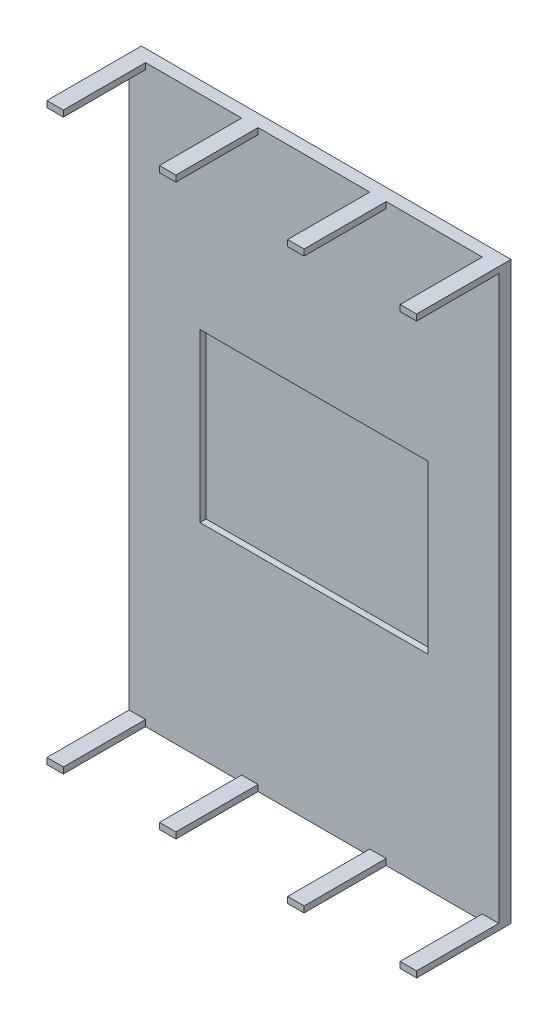
ISO-10303-21;
HEADER;
FILE_DESCRIPTION(('STEP AP214'),'2;1');
FILE_NAME('part.step','',(''),(''),'','','');
FILE_SCHEMA(('AUTOMOTIVE_DESIGN { 1 0 10303 214 1 1 1 1 }'));
ENDSEC;
DATA;
#1=APPLICATION_CONTEXT('core data for automotive mechanical design processes');
#2=APPLICATION_PROTOCOL_DEFINITION('international standard','automotive_design',2000,#1);
#3=PRODUCT_CONTEXT('',#1,'mechanical');
#4=PRODUCT('Part','Part','',(#3));
#5=PRODUCT_RELATED_PRODUCT_CATEGORY('part','',(#4));
#6=PRODUCT_DEFINITION_FORMATION('','',#4);
#7=PRODUCT_DEFINITION_CONTEXT('part definition',#1,'design');
#8=PRODUCT_DEFINITION('design','',#6,#7);
#9=PRODUCT_DEFINITION_SHAPE('','',#8);
#10=(LENGTH_UNIT() NAMED_UNIT(*) SI_UNIT(.MILLI.,.METRE.));
#11=(NAMED_UNIT(*) PLANE_ANGLE_UNIT() SI_UNIT($,.RADIAN.));
#12=(NAMED_UNIT(*) SI_UNIT($,.STERADIAN.) SOLID_ANGLE_UNIT());
#13=UNCERTAINTY_MEASURE_WITH_UNIT(LENGTH_MEASURE(1.E-05),#10,'distance_accuracy_value','');
#14=(GEOMETRIC_REPRESENTATION_CONTEXT(3) GLOBAL_UNCERTAINTY_ASSIGNED_CONTEXT((#13)) GLOBAL_UNIT_ASSIGNED_CONTEXT((#10,
#11,#12)) REPRESENTATION_CONTEXT('',''));
#15=CARTESIAN_POINT('',(0.,0.,0.));
#16=DIRECTION('',(0.,0.,1.));
#17=DIRECTION('',(1.,0.,0.));
#18=AXIS2_PLACEMENT_3D('',#15,#16,#17);
#19=CARTESIAN_POINT('',(0.,0.,3.));
#20=DIRECTION('',(0.,0.,1.));
#21=DIRECTION('',(1.,0.,0.));
#22=AXIS2_PLACEMENT_3D('',#19,#20,#21);
#23=PLANE('',#22);
#24=DIRECTION('',(0.,-1.,0.));
#25=VECTOR('',#24,1.);
#26=CARTESIAN_POINT('',(-27.75,-20.35,3.));
#27=LINE('',#26,#25);
#28=CARTESIAN_POINT('',(-27.75,20.35,3.));
#29=VERTEX_POINT('',#28);
#30=CARTESIAN_POINT('',(-27.75,-20.35,3.));
#31=VERTEX_POINT('',#30);
#32=EDGE_CURVE('E63',#29,#31,#27,.T.);
#33=ORIENTED_EDGE('',*,*,#32,.F.);
#34=DIRECTION('',(-1.,0.,0.));
#35=VECTOR('',#34,1.);
#36=CARTESIAN_POINT('',(-27.75,20.35,3.));
#37=LINE('',#36,#35);
#38=CARTESIAN_POINT('',(27.75,20.35,3.));
#39=VERTEX_POINT('',#38);
#40=EDGE_CURVE('E304',#39,#29,#37,.T.);
#41=ORIENTED_EDGE('',*,*,#40,.F.);
#42=DIRECTION('',(0.,1.,0.));
#43=VECTOR('',#42,1.);
#44=CARTESIAN_POINT('',(27.75,-20.35,3.));
#45=LINE('',#44,#43);
#46=CARTESIAN_POINT('',(27.75,-20.35,3.));
#47=VERTEX_POINT('',#46);
#48=EDGE_CURVE('E308',#47,#39,#45,.T.);
#49=ORIENTED_EDGE('',*,*,#48,.F.);
#50=DIRECTION('',(1.,0.,0.));
#51=VECTOR('',#50,1.);
#52=CARTESIAN_POINT('',(-27.75,-20.35,3.));
#53=LINE('',#52,#51);
#54=EDGE_CURVE('E317',#31,#47,#53,.T.);
#55=ORIENTED_EDGE('',*,*,#54,.F.);
#56=EDGE_LOOP('',(#33,#41,#49,#55));
#57=FACE_BOUND('',#56,.T.);
#58=DIRECTION('',(0.,-1.,0.));
#59=VECTOR('',#58,1.);
#60=CARTESIAN_POINT('',(-45.,70.,3.));
#61=LINE('',#60,#59);
#62=CARTESIAN_POINT('',(-45.,68.5,3.));
#63=VERTEX_POINT('',#62);
#64=CARTESIAN_POINT('',(-45.,-68.5,3.));
#65=VERTEX_POINT('',#64);
#66=EDGE_CURVE('E635',#63,#65,#61,.T.);
#67=ORIENTED_EDGE('',*,*,#66,.T.);
#68=DIRECTION('',(1.,0.,0.));
#69=VECTOR('',#68,1.);
#70=CARTESIAN_POINT('',(0.,-68.5,3.));
#71=LINE('',#70,#69);
#72=CARTESIAN_POINT('',(-41.,-68.5,3.));
#73=VERTEX_POINT('',#72);
#74=EDGE_CURVE('E497',#65,#73,#71,.T.);
#75=ORIENTED_EDGE('',*,*,#74,.T.);
#76=DIRECTION('',(0.,1.,0.));
#77=VECTOR('',#76,1.);
#78=CARTESIAN_POINT('',(-41.,0.,3.));
#79=LINE('',#78,#77);
#80=CARTESIAN_POINT('',(-41.,-70.,3.));
#81=VERTEX_POINT('',#80);
#82=EDGE_CURVE('E454',#81,#73,#79,.T.);
#83=ORIENTED_EDGE('',*,*,#82,.F.);
#84=DIRECTION('',(1.,0.,0.));
#85=VECTOR('',#84,1.);
#86=CARTESIAN_POINT('',(45.,-70.,3.));
#87=LINE('',#86,#85);
#88=CARTESIAN_POINT('',(-17.6,-70.,3.));
#89=VERTEX_POINT('',#88);
#90=EDGE_CURVE('E642',#81,#89,#87,.T.);
#91=ORIENTED_EDGE('',*,*,#90,.T.);
#92=DIRECTION('',(0.,1.,0.));
#93=VECTOR('',#92,1.);
#94=CARTESIAN_POINT('',(-17.6000000000003,0.,3.));
#95=LINE('',#94,#93);
#96=CARTESIAN_POINT('',(-17.6,-68.5,3.));
#97=VERTEX_POINT('',#96);
#98=EDGE_CURVE('E350',#89,#97,#95,.T.);
#99=ORIENTED_EDGE('',*,*,#98,.T.);
#100=DIRECTION('',(1.,0.,0.));
#101=VECTOR('',#100,1.);
#102=CARTESIAN_POINT('',(0.,-68.5,3.));
#103=LINE('',#102,#101);
#104=CARTESIAN_POINT('',(-13.6,-68.5,3.));
#105=VERTEX_POINT('',#104);
#106=EDGE_CURVE('E353',#97,#105,#103,.T.);
#107=ORIENTED_EDGE('',*,*,#106,.T.);
#108=DIRECTION('',(0.,1.,0.));
#109=VECTOR('',#108,1.);
#110=CARTESIAN_POINT('',(-13.6,0.,3.));
#111=LINE('',#110,#109);
#112=CARTESIAN_POINT('',(-13.6,-70.,3.));
#113=VERTEX_POINT('',#112);
#114=EDGE_CURVE('E357',#113,#105,#111,.T.);
#115=ORIENTED_EDGE('',*,*,#114,.F.);
#116=CARTESIAN_POINT('',(13.6,-70.,3.));
#117=VERTEX_POINT('',#116);
#118=EDGE_CURVE('E641',#113,#117,#87,.T.);
#119=ORIENTED_EDGE('',*,*,#118,.T.);
#120=DIRECTION('',(0.,1.,0.));
#121=VECTOR('',#120,1.);
#122=CARTESIAN_POINT('',(13.6,-70.,3.));
#123=LINE('',#122,#121);
#124=CARTESIAN_POINT('',(13.6,-68.5,3.));
#125=VERTEX_POINT('',#124);
#126=EDGE_CURVE('E393',#117,#125,#123,.T.);
#127=ORIENTED_EDGE('',*,*,#126,.T.);
#128=DIRECTION('',(-1.,0.,0.));
#129=VECTOR('',#128,1.);
#130=CARTESIAN_POINT('',(17.6,-68.5,3.));
#131=LINE('',#130,#129);
#132=CARTESIAN_POINT('',(17.6,-68.5,3.));
#133=VERTEX_POINT('',#132);
#134=EDGE_CURVE('E396',#133,#125,#131,.T.);
#135=ORIENTED_EDGE('',*,*,#134,.F.);
#136=DIRECTION('',(0.,1.,0.));
#137=VECTOR('',#136,1.);
#138=CARTESIAN_POINT('',(17.6,-70.,3.));
#139=LINE('',#138,#137);
#140=CARTESIAN_POINT('',(17.6,-70.,3.));
#141=VERTEX_POINT('',#140);
#142=EDGE_CURVE('E337',#141,#133,#139,.T.);
#143=ORIENTED_EDGE('',*,*,#142,.F.);
#144=CARTESIAN_POINT('',(41.,-70.,3.));
#145=VERTEX_POINT('',#144);
#146=EDGE_CURVE('E638',#141,#145,#87,.T.);
#147=ORIENTED_EDGE('',*,*,#146,.T.);
#148=DIRECTION('',(0.,1.,0.));
#149=VECTOR('',#148,1.);
#150=CARTESIAN_POINT('',(41.,-70.,3.));
#151=LINE('',#150,#149);
#152=CARTESIAN_POINT('',(41.,-68.5,3.));
#153=VERTEX_POINT('',#152);
#154=EDGE_CURVE('E429',#145,#153,#151,.T.);
#155=ORIENTED_EDGE('',*,*,#154,.T.);
#156=DIRECTION('',(-1.,0.,0.));
#157=VECTOR('',#156,1.);
#158=CARTESIAN_POINT('',(45.,-68.5,3.));
#159=LINE('',#158,#157);
#160=CARTESIAN_POINT('',(45.,-68.5,3.));
#161=VERTEX_POINT('',#160);
#162=EDGE_CURVE('E380',#161,#153,#159,.T.);
#163=ORIENTED_EDGE('',*,*,#162,.F.);
#164=DIRECTION('',(0.,1.,0.));
#165=VECTOR('',#164,1.);
#166=CARTESIAN_POINT('',(45.,70.,3.));
#167=LINE('',#166,#165);
#168=CARTESIAN_POINT('',(45.,68.5,3.));
#169=VERTEX_POINT('',#168);
#170=EDGE_CURVE('E643',#161,#169,#167,.T.);
#171=ORIENTED_EDGE('',*,*,#170,.T.);
#172=DIRECTION('',(-1.,0.,0.));
#173=VECTOR('',#172,1.);
#174=CARTESIAN_POINT('',(0.,68.5,3.));
#175=LINE('',#174,#173);
#176=CARTESIAN_POINT('',(41.,68.5,3.));
#177=VERTEX_POINT('',#176);
#178=EDGE_CURVE('E463',#169,#177,#175,.T.);
#179=ORIENTED_EDGE('',*,*,#178,.T.);
#180=DIRECTION('',(0.,-1.,0.));
#181=VECTOR('',#180,1.);
#182=CARTESIAN_POINT('',(41.,0.,3.));
#183=LINE('',#182,#181);
#184=CARTESIAN_POINT('',(41.,70.,3.));
#185=VERTEX_POINT('',#184);
#186=EDGE_CURVE('E466',#185,#177,#183,.T.);
#187=ORIENTED_EDGE('',*,*,#186,.F.);
#188=DIRECTION('',(-1.,0.,0.));
#189=VECTOR('',#188,1.);
#190=CARTESIAN_POINT('',(45.,70.,3.));
#191=LINE('',#190,#189);
#192=CARTESIAN_POINT('',(17.6,70.,3.));
#193=VERTEX_POINT('',#192);
#194=EDGE_CURVE('E634',#185,#193,#191,.T.);
#195=ORIENTED_EDGE('',*,*,#194,.T.);
#196=DIRECTION('',(0.,-1.,0.));
#197=VECTOR('',#196,1.);
#198=CARTESIAN_POINT('',(17.6000000000003,0.,3.));
#199=LINE('',#198,#197);
#200=CARTESIAN_POINT('',(17.6,68.5,3.));
#201=VERTEX_POINT('',#200);
#202=EDGE_CURVE('E71',#193,#201,#199,.T.);
#203=ORIENTED_EDGE('',*,*,#202,.T.);
#204=DIRECTION('',(-1.,0.,0.));
#205=VECTOR('',#204,1.);
#206=CARTESIAN_POINT('',(0.,68.5,3.));
#207=LINE('',#206,#205);
#208=CARTESIAN_POINT('',(13.6,68.5,3.));
#209=VERTEX_POINT('',#208);
#210=EDGE_CURVE('E576',#201,#209,#207,.T.);
#211=ORIENTED_EDGE('',*,*,#210,.T.);
#212=DIRECTION('',(0.,-1.,0.));
#213=VECTOR('',#212,1.);
#214=CARTESIAN_POINT('',(13.6,0.,3.));
#215=LINE('',#214,#213);
#216=CARTESIAN_POINT('',(13.6,70.,3.));
#217=VERTEX_POINT('',#216);
#218=EDGE_CURVE('E522',#217,#209,#215,.T.);
#219=ORIENTED_EDGE('',*,*,#218,.F.);
#220=CARTESIAN_POINT('',(-13.6,70.,3.));
#221=VERTEX_POINT('',#220);
#222=EDGE_CURVE('E632',#217,#221,#191,.T.);
#223=ORIENTED_EDGE('',*,*,#222,.T.);
#224=DIRECTION('',(0.,-1.,0.));
#225=VECTOR('',#224,1.);
#226=CARTESIAN_POINT('',(-13.6,0.,3.));
#227=LINE('',#226,#225);
#228=CARTESIAN_POINT('',(-13.6,68.5,3.));
#229=VERTEX_POINT('',#228);
#230=EDGE_CURVE('E544',#221,#229,#227,.T.);
#231=ORIENTED_EDGE('',*,*,#230,.T.);
#232=DIRECTION('',(1.,0.,0.));
#233=VECTOR('',#232,1.);
#234=CARTESIAN_POINT('',(0.,68.5,3.));
#235=LINE('',#234,#233);
#236=CARTESIAN_POINT('',(-17.6,68.5,3.));
#237=VERTEX_POINT('',#236);
#238=EDGE_CURVE('E535',#237,#229,#235,.T.);
#239=ORIENTED_EDGE('',*,*,#238,.F.);
#240=DIRECTION('',(0.,-1.,0.));
#241=VECTOR('',#240,1.);
#242=CARTESIAN_POINT('',(-17.6000000000003,0.,3.));
#243=LINE('',#242,#241);
#244=CARTESIAN_POINT('',(-17.6,70.,3.));
#245=VERTEX_POINT('',#244);
#246=EDGE_CURVE('E539',#245,#237,#243,.T.);
#247=ORIENTED_EDGE('',*,*,#246,.F.);
#248=CARTESIAN_POINT('',(-41.,70.,3.));
#249=VERTEX_POINT('',#248);
#250=EDGE_CURVE('E629',#245,#249,#191,.T.);
#251=ORIENTED_EDGE('',*,*,#250,.T.);
#252=DIRECTION('',(0.,-1.,0.));
#253=VECTOR('',#252,1.);
#254=CARTESIAN_POINT('',(-41.,0.,3.));
#255=LINE('',#254,#253);
#256=CARTESIAN_POINT('',(-41.,68.5,3.));
#257=VERTEX_POINT('',#256);
#258=EDGE_CURVE('E547',#249,#257,#255,.T.);
#259=ORIENTED_EDGE('',*,*,#258,.T.);
#260=DIRECTION('',(1.,0.,0.));
#261=VECTOR('',#260,1.);
#262=CARTESIAN_POINT('',(0.,68.5,3.));
#263=LINE('',#262,#261);
#264=EDGE_CURVE('E601',#63,#257,#263,.T.);
#265=ORIENTED_EDGE('',*,*,#264,.F.);
#266=EDGE_LOOP('',(#67,#75,#83,#91,#99,#107,#115,#119,#127,#135,#143,#147,#155,#163,#171,#179,
#187,#195,#203,#211,#219,#223,#231,#239,#247,#251,#259,#265));
#267=FACE_BOUND('',#266,.T.);
#268=ADVANCED_FACE('F47',(#57,#267),#23,.T.);
#269=CARTESIAN_POINT('',(45.,70.,3.));
#270=DIRECTION('',(0.,-1.,0.));
#271=DIRECTION('',(0.,0.,-1.));
#272=AXIS2_PLACEMENT_3D('',#269,#270,#271);
#273=PLANE('',#272);
#274=DIRECTION('',(-1.,0.,0.));
#275=VECTOR('',#274,1.);
#276=CARTESIAN_POINT('',(45.,70.,0.));
#277=LINE('',#276,#275);
#278=CARTESIAN_POINT('',(45.,70.,0.));
#279=VERTEX_POINT('',#278);
#280=CARTESIAN_POINT('',(-45.,70.,0.));
#281=VERTEX_POINT('',#280);
#282=EDGE_CURVE('E628',#279,#281,#277,.T.);
#283=ORIENTED_EDGE('',*,*,#282,.T.);
#284=DIRECTION('',(0.,0.,-1.));
#285=VECTOR('',#284,1.);
#286=CARTESIAN_POINT('',(-45.,70.,3.));
#287=LINE('',#286,#285);
#288=CARTESIAN_POINT('',(-45.,70.,23.));
#289=VERTEX_POINT('',#288);
#290=EDGE_CURVE('E11',#289,#281,#287,.T.);
#291=ORIENTED_EDGE('',*,*,#290,.F.);
#292=DIRECTION('',(-1.,0.,0.));
#293=VECTOR('',#292,1.);
#294=CARTESIAN_POINT('',(0.,70.,23.));
#295=LINE('',#294,#293);
#296=CARTESIAN_POINT('',(-41.,70.,23.));
#297=VERTEX_POINT('',#296);
#298=EDGE_CURVE('E600',#297,#289,#295,.T.);
#299=ORIENTED_EDGE('',*,*,#298,.F.);
#300=DIRECTION('',(0.,0.,-1.));
#301=VECTOR('',#300,1.);
#302=CARTESIAN_POINT('',(-41.,70.,23.));
#303=LINE('',#302,#301);
#304=EDGE_CURVE('E624',#297,#249,#303,.T.);
#305=ORIENTED_EDGE('',*,*,#304,.T.);
#306=ORIENTED_EDGE('',*,*,#250,.F.);
#307=DIRECTION('',(0.,0.,-1.));
#308=VECTOR('',#307,1.);
#309=CARTESIAN_POINT('',(-17.6,70.,23.));
#310=LINE('',#309,#308);
#311=CARTESIAN_POINT('',(-17.6,70.,23.));
#312=VERTEX_POINT('',#311);
#313=EDGE_CURVE('E521',#312,#245,#310,.T.);
#314=ORIENTED_EDGE('',*,*,#313,.F.);
#315=DIRECTION('',(-1.,0.,0.));
#316=VECTOR('',#315,1.);
#317=CARTESIAN_POINT('',(0.,70.,23.));
#318=LINE('',#317,#316);
#319=CARTESIAN_POINT('',(-13.6,70.,23.));
#320=VERTEX_POINT('',#319);
#321=EDGE_CURVE('E553',#320,#312,#318,.T.);
#322=ORIENTED_EDGE('',*,*,#321,.F.);
#323=DIRECTION('',(0.,0.,-1.));
#324=VECTOR('',#323,1.);
#325=CARTESIAN_POINT('',(-13.6,70.,23.));
#326=LINE('',#325,#324);
#327=EDGE_CURVE('E517',#320,#221,#326,.T.);
#328=ORIENTED_EDGE('',*,*,#327,.T.);
#329=ORIENTED_EDGE('',*,*,#222,.F.);
#330=DIRECTION('',(0.,0.,-1.));
#331=VECTOR('',#330,1.);
#332=CARTESIAN_POINT('',(13.6,70.,23.));
#333=LINE('',#332,#331);
#334=CARTESIAN_POINT('',(13.6,70.,23.));
#335=VERTEX_POINT('',#334);
#336=EDGE_CURVE('E471',#335,#217,#333,.T.);
#337=ORIENTED_EDGE('',*,*,#336,.F.);
#338=DIRECTION('',(-1.,0.,0.));
#339=VECTOR('',#338,1.);
#340=CARTESIAN_POINT('',(0.,70.,23.));
#341=LINE('',#340,#339);
#342=CARTESIAN_POINT('',(17.6,70.,23.));
#343=VERTEX_POINT('',#342);
#344=EDGE_CURVE('E577',#343,#335,#341,.T.);
#345=ORIENTED_EDGE('',*,*,#344,.F.);
#346=DIRECTION('',(0.,0.,-1.));
#347=VECTOR('',#346,1.);
#348=CARTESIAN_POINT('',(17.6,70.,23.));
#349=LINE('',#348,#347);
#350=EDGE_CURVE('E569',#343,#193,#349,.T.);
#351=ORIENTED_EDGE('',*,*,#350,.T.);
#352=ORIENTED_EDGE('',*,*,#194,.F.);
#353=DIRECTION('',(0.,0.,-1.));
#354=VECTOR('',#353,1.);
#355=CARTESIAN_POINT('',(41.,70.,23.));
#356=LINE('',#355,#354);
#357=CARTESIAN_POINT('',(41.,70.,23.));
#358=VERTEX_POINT('',#357);
#359=EDGE_CURVE('E449',#358,#185,#356,.T.);
#360=ORIENTED_EDGE('',*,*,#359,.F.);
#361=DIRECTION('',(-1.,0.,0.));
#362=VECTOR('',#361,1.);
#363=CARTESIAN_POINT('',(0.,70.,23.));
#364=LINE('',#363,#362);
#365=CARTESIAN_POINT('',(45.,70.,23.));
#366=VERTEX_POINT('',#365);
#367=EDGE_CURVE('E467',#366,#358,#364,.T.);
#368=ORIENTED_EDGE('',*,*,#367,.F.);
#369=DIRECTION('',(0.,0.,-1.));
#370=VECTOR('',#369,1.);
#371=CARTESIAN_POINT('',(45.,70.,3.));
#372=LINE('',#371,#370);
#373=EDGE_CURVE('E646',#366,#279,#372,.T.);
#374=ORIENTED_EDGE('',*,*,#373,.T.);
#375=EDGE_LOOP('',(#283,#291,#299,#305,#306,#314,#322,#328,#329,#337,#345,#351,#352,#360,#368,#374));
#376=FACE_BOUND('',#375,.T.);
#377=ADVANCED_FACE('F49',(#376),#273,.F.);
#378=CARTESIAN_POINT('',(-45.,70.,3.));
#379=DIRECTION('',(1.,0.,0.));
#380=DIRECTION('',(0.,1.,0.));
#381=AXIS2_PLACEMENT_3D('',#378,#379,#380);
#382=PLANE('',#381);
#383=DIRECTION('',(0.,-1.,0.));
#384=VECTOR('',#383,1.);
#385=CARTESIAN_POINT('',(-45.,70.,0.));
#386=LINE('',#385,#384);
#387=CARTESIAN_POINT('',(-45.,-70.,0.));
#388=VERTEX_POINT('',#387);
#389=EDGE_CURVE('E650',#281,#388,#386,.T.);
#390=ORIENTED_EDGE('',*,*,#389,.T.);
#391=DIRECTION('',(0.,0.,-1.));
#392=VECTOR('',#391,1.);
#393=CARTESIAN_POINT('',(-45.,-70.,3.));
#394=LINE('',#393,#392);
#395=CARTESIAN_POINT('',(-45.,-70.,23.));
#396=VERTEX_POINT('',#395);
#397=EDGE_CURVE('E56',#396,#388,#394,.T.);
#398=ORIENTED_EDGE('',*,*,#397,.F.);
#399=DIRECTION('',(0.,-1.,0.));
#400=VECTOR('',#399,1.);
#401=CARTESIAN_POINT('',(-45.,0.,23.));
#402=LINE('',#401,#400);
#403=CARTESIAN_POINT('',(-45.,-68.5,23.));
#404=VERTEX_POINT('',#403);
#405=EDGE_CURVE('E496',#404,#396,#402,.T.);
#406=ORIENTED_EDGE('',*,*,#405,.F.);
#407=DIRECTION('',(0.,0.,-1.));
#408=VECTOR('',#407,1.);
#409=CARTESIAN_POINT('',(-45.,-68.5,23.));
#410=LINE('',#409,#408);
#411=EDGE_CURVE('E492',#404,#65,#410,.T.);
#412=ORIENTED_EDGE('',*,*,#411,.T.);
#413=ORIENTED_EDGE('',*,*,#66,.F.);
#414=DIRECTION('',(0.,0.,-1.));
#415=VECTOR('',#414,1.);
#416=CARTESIAN_POINT('',(-45.,68.5,23.));
#417=LINE('',#416,#415);
#418=CARTESIAN_POINT('',(-45.,68.5,23.));
#419=VERTEX_POINT('',#418);
#420=EDGE_CURVE('E620',#419,#63,#417,.T.);
#421=ORIENTED_EDGE('',*,*,#420,.F.);
#422=DIRECTION('',(0.,-1.,0.));
#423=VECTOR('',#422,1.);
#424=CARTESIAN_POINT('',(-45.,0.,23.));
#425=LINE('',#424,#423);
#426=EDGE_CURVE('E605',#289,#419,#425,.T.);
#427=ORIENTED_EDGE('',*,*,#426,.F.);
#428=ORIENTED_EDGE('',*,*,#290,.T.);
#429=EDGE_LOOP('',(#390,#398,#406,#412,#413,#421,#427,#428));
#430=FACE_BOUND('',#429,.T.);
#431=ADVANCED_FACE('F723',(#430),#382,.F.);
#432=CARTESIAN_POINT('',(45.,-70.,3.));
#433=DIRECTION('',(0.,1.,0.));
#434=DIRECTION('',(-1.,0.,0.));
#435=AXIS2_PLACEMENT_3D('',#432,#433,#434);
#436=PLANE('',#435);
#437=DIRECTION('',(1.,0.,0.));
#438=VECTOR('',#437,1.);
#439=CARTESIAN_POINT('',(45.,-70.,0.));
#440=LINE('',#439,#438);
#441=CARTESIAN_POINT('',(45.,-70.,0.));
#442=VERTEX_POINT('',#441);
#443=EDGE_CURVE('E653',#388,#442,#440,.T.);
#444=ORIENTED_EDGE('',*,*,#443,.T.);
#445=DIRECTION('',(0.,0.,-1.));
#446=VECTOR('',#445,1.);
#447=CARTESIAN_POINT('',(45.,-70.,3.));
#448=LINE('',#447,#446);
#449=CARTESIAN_POINT('',(45.,-70.,23.));
#450=VERTEX_POINT('',#449);
#451=EDGE_CURVE('E661',#450,#442,#448,.T.);
#452=ORIENTED_EDGE('',*,*,#451,.F.);
#453=DIRECTION('',(-1.,0.,0.));
#454=VECTOR('',#453,1.);
#455=CARTESIAN_POINT('',(45.,-70.,23.));
#456=LINE('',#455,#454);
#457=CARTESIAN_POINT('',(41.,-70.,23.));
#458=VERTEX_POINT('',#457);
#459=EDGE_CURVE('E428',#450,#458,#456,.T.);
#460=ORIENTED_EDGE('',*,*,#459,.T.);
#461=DIRECTION('',(0.,0.,-1.));
#462=VECTOR('',#461,1.);
#463=CARTESIAN_POINT('',(41.,-70.,23.));
#464=LINE('',#463,#462);
#465=EDGE_CURVE('E424',#458,#145,#464,.T.);
#466=ORIENTED_EDGE('',*,*,#465,.T.);
#467=ORIENTED_EDGE('',*,*,#146,.F.);
#468=DIRECTION('',(0.,0.,-1.));
#469=VECTOR('',#468,1.);
#470=CARTESIAN_POINT('',(17.6,-70.,23.));
#471=LINE('',#470,#469);
#472=CARTESIAN_POINT('',(17.6,-70.,23.));
#473=VERTEX_POINT('',#472);
#474=EDGE_CURVE('E388',#473,#141,#471,.T.);
#475=ORIENTED_EDGE('',*,*,#474,.F.);
#476=DIRECTION('',(-1.,0.,0.));
#477=VECTOR('',#476,1.);
#478=CARTESIAN_POINT('',(17.6,-70.,23.));
#479=LINE('',#478,#477);
#480=CARTESIAN_POINT('',(13.6,-70.,23.));
#481=VERTEX_POINT('',#480);
#482=EDGE_CURVE('E392',#473,#481,#479,.T.);
#483=ORIENTED_EDGE('',*,*,#482,.T.);
#484=DIRECTION('',(0.,0.,-1.));
#485=VECTOR('',#484,1.);
#486=CARTESIAN_POINT('',(13.6,-70.,23.));
#487=LINE('',#486,#485);
#488=EDGE_CURVE('E384',#481,#117,#487,.T.);
#489=ORIENTED_EDGE('',*,*,#488,.T.);
#490=ORIENTED_EDGE('',*,*,#118,.F.);
#491=DIRECTION('',(0.,0.,-1.));
#492=VECTOR('',#491,1.);
#493=CARTESIAN_POINT('',(-13.6,-70.,23.));
#494=LINE('',#493,#492);
#495=CARTESIAN_POINT('',(-13.6,-70.,23.));
#496=VERTEX_POINT('',#495);
#497=EDGE_CURVE('E332',#496,#113,#494,.T.);
#498=ORIENTED_EDGE('',*,*,#497,.F.);
#499=DIRECTION('',(1.,0.,0.));
#500=VECTOR('',#499,1.);
#501=CARTESIAN_POINT('',(0.,-70.,23.));
#502=LINE('',#501,#500);
#503=CARTESIAN_POINT('',(-17.6,-70.,23.));
#504=VERTEX_POINT('',#503);
#505=EDGE_CURVE('E354',#504,#496,#502,.T.);
#506=ORIENTED_EDGE('',*,*,#505,.F.);
#507=DIRECTION('',(0.,0.,-1.));
#508=VECTOR('',#507,1.);
#509=CARTESIAN_POINT('',(-17.6,-70.,23.));
#510=LINE('',#509,#508);
#511=EDGE_CURVE('E345',#504,#89,#510,.T.);
#512=ORIENTED_EDGE('',*,*,#511,.T.);
#513=ORIENTED_EDGE('',*,*,#90,.F.);
#514=DIRECTION('',(0.,0.,-1.));
#515=VECTOR('',#514,1.);
#516=CARTESIAN_POINT('',(-41.,-70.,23.));
#517=LINE('',#516,#515);
#518=CARTESIAN_POINT('',(-41.,-70.,23.));
#519=VERTEX_POINT('',#518);
#520=EDGE_CURVE('E361',#519,#81,#517,.T.);
#521=ORIENTED_EDGE('',*,*,#520,.F.);
#522=DIRECTION('',(1.,0.,0.));
#523=VECTOR('',#522,1.);
#524=CARTESIAN_POINT('',(0.,-70.,23.));
#525=LINE('',#524,#523);
#526=EDGE_CURVE('E500',#396,#519,#525,.T.);
#527=ORIENTED_EDGE('',*,*,#526,.F.);
#528=ORIENTED_EDGE('',*,*,#397,.T.);
#529=EDGE_LOOP('',(#444,#452,#460,#466,#467,#475,#483,#489,#490,#498,#506,#512,#513,#521,#527,#528));
#530=FACE_BOUND('',#529,.T.);
#531=ADVANCED_FACE('F669',(#530),#436,.F.);
#532=CARTESIAN_POINT('',(45.,70.,3.));
#533=DIRECTION('',(-1.,0.,0.));
#534=DIRECTION('',(0.,-1.,0.));
#535=AXIS2_PLACEMENT_3D('',#532,#533,#534);
#536=PLANE('',#535);
#537=DIRECTION('',(0.,1.,0.));
#538=VECTOR('',#537,1.);
#539=CARTESIAN_POINT('',(45.,70.,0.));
#540=LINE('',#539,#538);
#541=EDGE_CURVE('E633',#442,#279,#540,.T.);
#542=ORIENTED_EDGE('',*,*,#541,.T.);
#543=ORIENTED_EDGE('',*,*,#373,.F.);
#544=DIRECTION('',(0.,1.,0.));
#545=VECTOR('',#544,1.);
#546=CARTESIAN_POINT('',(45.,0.,23.));
#547=LINE('',#546,#545);
#548=CARTESIAN_POINT('',(45.,68.5,23.));
#549=VERTEX_POINT('',#548);
#550=EDGE_CURVE('E462',#549,#366,#547,.T.);
#551=ORIENTED_EDGE('',*,*,#550,.F.);
#552=DIRECTION('',(0.,0.,-1.));
#553=VECTOR('',#552,1.);
#554=CARTESIAN_POINT('',(45.,68.5,23.));
#555=LINE('',#554,#553);
#556=EDGE_CURVE('E458',#549,#169,#555,.T.);
#557=ORIENTED_EDGE('',*,*,#556,.T.);
#558=ORIENTED_EDGE('',*,*,#170,.F.);
#559=DIRECTION('',(0.,0.,-1.));
#560=VECTOR('',#559,1.);
#561=CARTESIAN_POINT('',(45.,-68.5,23.));
#562=LINE('',#561,#560);
#563=CARTESIAN_POINT('',(45.,-68.5,23.));
#564=VERTEX_POINT('',#563);
#565=EDGE_CURVE('E326',#564,#161,#562,.T.);
#566=ORIENTED_EDGE('',*,*,#565,.F.);
#567=DIRECTION('',(0.,1.,0.));
#568=VECTOR('',#567,1.);
#569=CARTESIAN_POINT('',(45.,-70.,23.));
#570=LINE('',#569,#568);
#571=EDGE_CURVE('E432',#450,#564,#570,.T.);
#572=ORIENTED_EDGE('',*,*,#571,.F.);
#573=ORIENTED_EDGE('',*,*,#451,.T.);
#574=EDGE_LOOP('',(#542,#543,#551,#557,#558,#566,#572,#573));
#575=FACE_BOUND('',#574,.T.);
#576=ADVANCED_FACE('F678',(#575),#536,.F.);
#577=CARTESIAN_POINT('',(0.,0.,0.));
#578=DIRECTION('',(0.,0.,1.));
#579=DIRECTION('',(1.,0.,0.));
#580=AXIS2_PLACEMENT_3D('',#577,#578,#579);
#581=PLANE('',#580);
#582=ORIENTED_EDGE('',*,*,#282,.F.);
#583=ORIENTED_EDGE('',*,*,#541,.F.);
#584=ORIENTED_EDGE('',*,*,#443,.F.);
#585=ORIENTED_EDGE('',*,*,#389,.F.);
#586=EDGE_LOOP('',(#582,#583,#584,#585));
#587=FACE_BOUND('',#586,.T.);
#588=ADVANCED_FACE('F676',(#587),#581,.F.);
#589=CARTESIAN_POINT('',(-41.,0.,23.));
#590=DIRECTION('',(1.,0.,0.));
#591=DIRECTION('',(0.,0.,-1.));
#592=AXIS2_PLACEMENT_3D('',#589,#590,#591);
#593=PLANE('',#592);
#594=ORIENTED_EDGE('',*,*,#258,.F.);
#595=ORIENTED_EDGE('',*,*,#304,.F.);
#596=DIRECTION('',(0.,-1.,0.));
#597=VECTOR('',#596,1.);
#598=CARTESIAN_POINT('',(-41.,0.,23.));
#599=LINE('',#598,#597);
#600=CARTESIAN_POINT('',(-41.,68.5,23.));
#601=VERTEX_POINT('',#600);
#602=EDGE_CURVE('E596',#297,#601,#599,.T.);
#603=ORIENTED_EDGE('',*,*,#602,.T.);
#604=DIRECTION('',(0.,0.,-1.));
#605=VECTOR('',#604,1.);
#606=CARTESIAN_POINT('',(-41.,68.5,23.));
#607=LINE('',#606,#605);
#608=EDGE_CURVE('E611',#601,#257,#607,.T.);
#609=ORIENTED_EDGE('',*,*,#608,.T.);
#610=EDGE_LOOP('',(#594,#595,#603,#609));
#611=FACE_BOUND('',#610,.T.);
#612=ADVANCED_FACE('F726',(#611),#593,.T.);
#613=CARTESIAN_POINT('',(0.,68.5,23.));
#614=DIRECTION('',(0.,1.,0.));
#615=DIRECTION('',(0.,0.,1.));
#616=AXIS2_PLACEMENT_3D('',#613,#614,#615);
#617=PLANE('',#616);
#618=ORIENTED_EDGE('',*,*,#264,.T.);
#619=ORIENTED_EDGE('',*,*,#608,.F.);
#620=DIRECTION('',(1.,0.,0.));
#621=VECTOR('',#620,1.);
#622=CARTESIAN_POINT('',(0.,68.5,23.));
#623=LINE('',#622,#621);
#624=EDGE_CURVE('E608',#419,#601,#623,.T.);
#625=ORIENTED_EDGE('',*,*,#624,.F.);
#626=ORIENTED_EDGE('',*,*,#420,.T.);
#627=EDGE_LOOP('',(#618,#619,#625,#626));
#628=FACE_BOUND('',#627,.T.);
#629=ADVANCED_FACE('F790',(#628),#617,.F.);
#630=CARTESIAN_POINT('',(0.,0.,23.));
#631=DIRECTION('',(0.,0.,1.));
#632=DIRECTION('',(1.,0.,0.));
#633=AXIS2_PLACEMENT_3D('',#630,#631,#632);
#634=PLANE('',#633);
#635=ORIENTED_EDGE('',*,*,#602,.F.);
#636=ORIENTED_EDGE('',*,*,#298,.T.);
#637=ORIENTED_EDGE('',*,*,#426,.T.);
#638=ORIENTED_EDGE('',*,*,#624,.T.);
#639=EDGE_LOOP('',(#635,#636,#637,#638));
#640=FACE_BOUND('',#639,.T.);
#641=ADVANCED_FACE('F713',(#640),#634,.T.);
#642=CARTESIAN_POINT('',(45.,-68.5,23.));
#643=DIRECTION('',(0.,-1.,0.));
#644=DIRECTION('',(0.,0.,-1.));
#645=AXIS2_PLACEMENT_3D('',#642,#643,#644);
#646=PLANE('',#645);
#647=ORIENTED_EDGE('',*,*,#162,.T.);
#648=DIRECTION('',(0.,0.,-1.));
#649=VECTOR('',#648,1.);
#650=CARTESIAN_POINT('',(41.,-68.5,23.));
#651=LINE('',#650,#649);
#652=CARTESIAN_POINT('',(41.,-68.5,23.));
#653=VERTEX_POINT('',#652);
#654=EDGE_CURVE('E420',#653,#153,#651,.T.);
#655=ORIENTED_EDGE('',*,*,#654,.F.);
#656=DIRECTION('',(-1.,0.,0.));
#657=VECTOR('',#656,1.);
#658=CARTESIAN_POINT('',(45.,-68.5,23.));
#659=LINE('',#658,#657);
#660=EDGE_CURVE('E443',#564,#653,#659,.T.);
#661=ORIENTED_EDGE('',*,*,#660,.F.);
#662=ORIENTED_EDGE('',*,*,#565,.T.);
#663=EDGE_LOOP('',(#647,#655,#661,#662));
#664=FACE_BOUND('',#663,.T.);
#665=ADVANCED_FACE('F697',(#664),#646,.F.);
#666=CARTESIAN_POINT('',(41.,-70.,23.));
#667=DIRECTION('',(-1.,0.,0.));
#668=DIRECTION('',(0.,0.,1.));
#669=AXIS2_PLACEMENT_3D('',#666,#667,#668);
#670=PLANE('',#669);
#671=ORIENTED_EDGE('',*,*,#154,.F.);
#672=ORIENTED_EDGE('',*,*,#465,.F.);
#673=DIRECTION('',(0.,1.,0.));
#674=VECTOR('',#673,1.);
#675=CARTESIAN_POINT('',(41.,-70.,23.));
#676=LINE('',#675,#674);
#677=EDGE_CURVE('E439',#458,#653,#676,.T.);
#678=ORIENTED_EDGE('',*,*,#677,.T.);
#679=ORIENTED_EDGE('',*,*,#654,.T.);
#680=EDGE_LOOP('',(#671,#672,#678,#679));
#681=FACE_BOUND('',#680,.T.);
#682=ADVANCED_FACE('F704',(#681),#670,.T.);
#683=CARTESIAN_POINT('',(0.,0.,23.));
#684=DIRECTION('',(0.,0.,1.));
#685=DIRECTION('',(1.,0.,0.));
#686=AXIS2_PLACEMENT_3D('',#683,#684,#685);
#687=PLANE('',#686);
#688=ORIENTED_EDGE('',*,*,#571,.T.);
#689=ORIENTED_EDGE('',*,*,#660,.T.);
#690=ORIENTED_EDGE('',*,*,#677,.F.);
#691=ORIENTED_EDGE('',*,*,#459,.F.);
#692=EDGE_LOOP('',(#688,#689,#690,#691));
#693=FACE_BOUND('',#692,.T.);
#694=ADVANCED_FACE('F701',(#693),#687,.T.);
#695=CARTESIAN_POINT('',(17.6,-70.,23.));
#696=DIRECTION('',(-1.,0.,0.));
#697=DIRECTION('',(0.,-1.,0.));
#698=AXIS2_PLACEMENT_3D('',#695,#696,#697);
#699=PLANE('',#698);
#700=ORIENTED_EDGE('',*,*,#142,.T.);
#701=DIRECTION('',(0.,0.,-1.));
#702=VECTOR('',#701,1.);
#703=CARTESIAN_POINT('',(17.6,-68.5,23.));
#704=LINE('',#703,#702);
#705=CARTESIAN_POINT('',(17.6,-68.5,23.));
#706=VERTEX_POINT('',#705);
#707=EDGE_CURVE('E375',#706,#133,#704,.T.);
#708=ORIENTED_EDGE('',*,*,#707,.F.);
#709=DIRECTION('',(0.,1.,0.));
#710=VECTOR('',#709,1.);
#711=CARTESIAN_POINT('',(17.6,-70.,23.));
#712=LINE('',#711,#710);
#713=EDGE_CURVE('E397',#473,#706,#712,.T.);
#714=ORIENTED_EDGE('',*,*,#713,.F.);
#715=ORIENTED_EDGE('',*,*,#474,.T.);
#716=EDGE_LOOP('',(#700,#708,#714,#715));
#717=FACE_BOUND('',#716,.T.);
#718=ADVANCED_FACE('F711',(#717),#699,.F.);
#719=CARTESIAN_POINT('',(17.6,-68.5,23.));
#720=DIRECTION('',(0.,-1.,0.));
#721=DIRECTION('',(0.,0.,-1.));
#722=AXIS2_PLACEMENT_3D('',#719,#720,#721);
#723=PLANE('',#722);
#724=ORIENTED_EDGE('',*,*,#134,.T.);
#725=DIRECTION('',(0.,0.,-1.));
#726=VECTOR('',#725,1.);
#727=CARTESIAN_POINT('',(13.6,-68.5,23.));
#728=LINE('',#727,#726);
#729=CARTESIAN_POINT('',(13.6,-68.5,23.));
#730=VERTEX_POINT('',#729);
#731=EDGE_CURVE('E379',#730,#125,#728,.T.);
#732=ORIENTED_EDGE('',*,*,#731,.F.);
#733=DIRECTION('',(-1.,0.,0.));
#734=VECTOR('',#733,1.);
#735=CARTESIAN_POINT('',(17.6,-68.5,23.));
#736=LINE('',#735,#734);
#737=EDGE_CURVE('E411',#706,#730,#736,.T.);
#738=ORIENTED_EDGE('',*,*,#737,.F.);
#739=ORIENTED_EDGE('',*,*,#707,.T.);
#740=EDGE_LOOP('',(#724,#732,#738,#739));
#741=FACE_BOUND('',#740,.T.);
#742=ADVANCED_FACE('F948',(#741),#723,.F.);
#743=CARTESIAN_POINT('',(13.6,-70.,23.));
#744=DIRECTION('',(-1.,0.,0.));
#745=DIRECTION('',(0.,0.,1.));
#746=AXIS2_PLACEMENT_3D('',#743,#744,#745);
#747=PLANE('',#746);
#748=ORIENTED_EDGE('',*,*,#126,.F.);
#749=ORIENTED_EDGE('',*,*,#488,.F.);
#750=DIRECTION('',(0.,1.,0.));
#751=VECTOR('',#750,1.);
#752=CARTESIAN_POINT('',(13.6,-70.,23.));
#753=LINE('',#752,#751);
#754=EDGE_CURVE('E407',#481,#730,#753,.T.);
#755=ORIENTED_EDGE('',*,*,#754,.T.);
#756=ORIENTED_EDGE('',*,*,#731,.T.);
#757=EDGE_LOOP('',(#748,#749,#755,#756));
#758=FACE_BOUND('',#757,.T.);
#759=ADVANCED_FACE('F952',(#758),#747,.T.);
#760=CARTESIAN_POINT('',(0.,0.,23.));
#761=DIRECTION('',(0.,0.,1.));
#762=DIRECTION('',(1.,0.,0.));
#763=AXIS2_PLACEMENT_3D('',#760,#761,#762);
#764=PLANE('',#763);
#765=ORIENTED_EDGE('',*,*,#713,.T.);
#766=ORIENTED_EDGE('',*,*,#737,.T.);
#767=ORIENTED_EDGE('',*,*,#754,.F.);
#768=ORIENTED_EDGE('',*,*,#482,.F.);
#769=EDGE_LOOP('',(#765,#766,#767,#768));
#770=FACE_BOUND('',#769,.T.);
#771=ADVANCED_FACE('F934',(#770),#764,.T.);
#772=CARTESIAN_POINT('',(-13.6,0.,23.));
#773=DIRECTION('',(-1.,0.,0.));
#774=DIRECTION('',(0.,0.,1.));
#775=AXIS2_PLACEMENT_3D('',#772,#773,#774);
#776=PLANE('',#775);
#777=ORIENTED_EDGE('',*,*,#114,.T.);
#778=DIRECTION('',(0.,0.,-1.));
#779=VECTOR('',#778,1.);
#780=CARTESIAN_POINT('',(-13.6,-68.5,23.));
#781=LINE('',#780,#779);
#782=CARTESIAN_POINT('',(-13.6,-68.5,23.));
#783=VERTEX_POINT('',#782);
#784=EDGE_CURVE('E336',#783,#105,#781,.T.);
#785=ORIENTED_EDGE('',*,*,#784,.F.);
#786=DIRECTION('',(0.,1.,0.));
#787=VECTOR('',#786,1.);
#788=CARTESIAN_POINT('',(-13.6,0.,23.));
#789=LINE('',#788,#787);
#790=EDGE_CURVE('E369',#496,#783,#789,.T.);
#791=ORIENTED_EDGE('',*,*,#790,.F.);
#792=ORIENTED_EDGE('',*,*,#497,.T.);
#793=EDGE_LOOP('',(#777,#785,#791,#792));
#794=FACE_BOUND('',#793,.T.);
#795=ADVANCED_FACE('F930',(#794),#776,.F.);
#796=CARTESIAN_POINT('',(0.,-68.5,23.));
#797=DIRECTION('',(0.,1.,0.));
#798=DIRECTION('',(0.,0.,1.));
#799=AXIS2_PLACEMENT_3D('',#796,#797,#798);
#800=PLANE('',#799);
#801=ORIENTED_EDGE('',*,*,#106,.F.);
#802=DIRECTION('',(0.,0.,-1.));
#803=VECTOR('',#802,1.);
#804=CARTESIAN_POINT('',(-17.6,-68.5,23.));
#805=LINE('',#804,#803);
#806=CARTESIAN_POINT('',(-17.6,-68.5,23.));
#807=VERTEX_POINT('',#806);
#808=EDGE_CURVE('E341',#807,#97,#805,.T.);
#809=ORIENTED_EDGE('',*,*,#808,.F.);
#810=DIRECTION('',(1.,0.,0.));
#811=VECTOR('',#810,1.);
#812=CARTESIAN_POINT('',(0.,-68.5,23.));
#813=LINE('',#812,#811);
#814=EDGE_CURVE('E365',#807,#783,#813,.T.);
#815=ORIENTED_EDGE('',*,*,#814,.T.);
#816=ORIENTED_EDGE('',*,*,#784,.T.);
#817=EDGE_LOOP('',(#801,#809,#815,#816));
#818=FACE_BOUND('',#817,.T.);
#819=ADVANCED_FACE('F933',(#818),#800,.T.);
#820=CARTESIAN_POINT('',(-17.6000000000003,0.,23.));
#821=DIRECTION('',(-1.,0.,0.));
#822=DIRECTION('',(0.,-1.,0.));
#823=AXIS2_PLACEMENT_3D('',#820,#821,#822);
#824=PLANE('',#823);
#825=ORIENTED_EDGE('',*,*,#98,.F.);
#826=ORIENTED_EDGE('',*,*,#511,.F.);
#827=DIRECTION('',(0.,1.,0.));
#828=VECTOR('',#827,1.);
#829=CARTESIAN_POINT('',(-17.6000000000003,0.,23.));
#830=LINE('',#829,#828);
#831=EDGE_CURVE('E349',#504,#807,#830,.T.);
#832=ORIENTED_EDGE('',*,*,#831,.T.);
#833=ORIENTED_EDGE('',*,*,#808,.T.);
#834=EDGE_LOOP('',(#825,#826,#832,#833));
#835=FACE_BOUND('',#834,.T.);
#836=ADVANCED_FACE('F938',(#835),#824,.T.);
#837=CARTESIAN_POINT('',(0.,0.,23.));
#838=DIRECTION('',(0.,0.,1.));
#839=DIRECTION('',(1.,0.,0.));
#840=AXIS2_PLACEMENT_3D('',#837,#838,#839);
#841=PLANE('',#840);
#842=ORIENTED_EDGE('',*,*,#505,.T.);
#843=ORIENTED_EDGE('',*,*,#790,.T.);
#844=ORIENTED_EDGE('',*,*,#814,.F.);
#845=ORIENTED_EDGE('',*,*,#831,.F.);
#846=EDGE_LOOP('',(#842,#843,#844,#845));
#847=FACE_BOUND('',#846,.T.);
#848=ADVANCED_FACE('F821',(#847),#841,.T.);
#849=CARTESIAN_POINT('',(-13.6,0.,23.));
#850=DIRECTION('',(1.,0.,0.));
#851=DIRECTION('',(0.,0.,-1.));
#852=AXIS2_PLACEMENT_3D('',#849,#850,#851);
#853=PLANE('',#852);
#854=ORIENTED_EDGE('',*,*,#230,.F.);
#855=ORIENTED_EDGE('',*,*,#327,.F.);
#856=DIRECTION('',(0.,-1.,0.));
#857=VECTOR('',#856,1.);
#858=CARTESIAN_POINT('',(-13.6,0.,23.));
#859=LINE('',#858,#857);
#860=CARTESIAN_POINT('',(-13.6,68.5,23.));
#861=VERTEX_POINT('',#860);
#862=EDGE_CURVE('E540',#320,#861,#859,.T.);
#863=ORIENTED_EDGE('',*,*,#862,.T.);
#864=DIRECTION('',(0.,0.,-1.));
#865=VECTOR('',#864,1.);
#866=CARTESIAN_POINT('',(-13.6,68.5,23.));
#867=LINE('',#866,#865);
#868=EDGE_CURVE('E530',#861,#229,#867,.T.);
#869=ORIENTED_EDGE('',*,*,#868,.T.);
#870=EDGE_LOOP('',(#854,#855,#863,#869));
#871=FACE_BOUND('',#870,.T.);
#872=ADVANCED_FACE('F761',(#871),#853,.T.);
#873=CARTESIAN_POINT('',(-17.6000000000003,0.,23.));
#874=DIRECTION('',(1.,0.,0.));
#875=DIRECTION('',(0.,1.,0.));
#876=AXIS2_PLACEMENT_3D('',#873,#874,#875);
#877=PLANE('',#876);
#878=ORIENTED_EDGE('',*,*,#246,.T.);
#879=DIRECTION('',(0.,0.,-1.));
#880=VECTOR('',#879,1.);
#881=CARTESIAN_POINT('',(-17.6,68.5,23.));
#882=LINE('',#881,#880);
#883=CARTESIAN_POINT('',(-17.6,68.5,23.));
#884=VERTEX_POINT('',#883);
#885=EDGE_CURVE('E526',#884,#237,#882,.T.);
#886=ORIENTED_EDGE('',*,*,#885,.F.);
#887=DIRECTION('',(0.,-1.,0.));
#888=VECTOR('',#887,1.);
#889=CARTESIAN_POINT('',(-17.6000000000003,0.,23.));
#890=LINE('',#889,#888);
#891=EDGE_CURVE('E550',#312,#884,#890,.T.);
#892=ORIENTED_EDGE('',*,*,#891,.F.);
#893=ORIENTED_EDGE('',*,*,#313,.T.);
#894=EDGE_LOOP('',(#878,#886,#892,#893));
#895=FACE_BOUND('',#894,.T.);
#896=ADVANCED_FACE('F750',(#895),#877,.F.);
#897=CARTESIAN_POINT('',(0.,68.5,23.));
#898=DIRECTION('',(0.,1.,0.));
#899=DIRECTION('',(0.,0.,1.));
#900=AXIS2_PLACEMENT_3D('',#897,#898,#899);
#901=PLANE('',#900);
#902=ORIENTED_EDGE('',*,*,#238,.T.);
#903=ORIENTED_EDGE('',*,*,#868,.F.);
#904=DIRECTION('',(1.,0.,0.));
#905=VECTOR('',#904,1.);
#906=CARTESIAN_POINT('',(0.,68.5,23.));
#907=LINE('',#906,#905);
#908=EDGE_CURVE('E534',#884,#861,#907,.T.);
#909=ORIENTED_EDGE('',*,*,#908,.F.);
#910=ORIENTED_EDGE('',*,*,#885,.T.);
#911=EDGE_LOOP('',(#902,#903,#909,#910));
#912=FACE_BOUND('',#911,.T.);
#913=ADVANCED_FACE('F824',(#912),#901,.F.);
#914=CARTESIAN_POINT('',(0.,0.,23.));
#915=DIRECTION('',(0.,0.,1.));
#916=DIRECTION('',(1.,0.,0.));
#917=AXIS2_PLACEMENT_3D('',#914,#915,#916);
#918=PLANE('',#917);
#919=ORIENTED_EDGE('',*,*,#862,.F.);
#920=ORIENTED_EDGE('',*,*,#321,.T.);
#921=ORIENTED_EDGE('',*,*,#891,.T.);
#922=ORIENTED_EDGE('',*,*,#908,.T.);
#923=EDGE_LOOP('',(#919,#920,#921,#922));
#924=FACE_BOUND('',#923,.T.);
#925=ADVANCED_FACE('F755',(#924),#918,.T.);
#926=CARTESIAN_POINT('',(13.6,0.,23.));
#927=DIRECTION('',(1.,0.,0.));
#928=DIRECTION('',(0.,0.,-1.));
#929=AXIS2_PLACEMENT_3D('',#926,#927,#928);
#930=PLANE('',#929);
#931=ORIENTED_EDGE('',*,*,#218,.T.);
#932=DIRECTION('',(0.,0.,-1.));
#933=VECTOR('',#932,1.);
#934=CARTESIAN_POINT('',(13.6,68.5,23.));
#935=LINE('',#934,#933);
#936=CARTESIAN_POINT('',(13.6,68.5,23.));
#937=VERTEX_POINT('',#936);
#938=EDGE_CURVE('E562',#937,#209,#935,.T.);
#939=ORIENTED_EDGE('',*,*,#938,.F.);
#940=DIRECTION('',(0.,-1.,0.));
#941=VECTOR('',#940,1.);
#942=CARTESIAN_POINT('',(13.6,0.,23.));
#943=LINE('',#942,#941);
#944=EDGE_CURVE('E590',#335,#937,#943,.T.);
#945=ORIENTED_EDGE('',*,*,#944,.F.);
#946=ORIENTED_EDGE('',*,*,#336,.T.);
#947=EDGE_LOOP('',(#931,#939,#945,#946));
#948=FACE_BOUND('',#947,.T.);
#949=ADVANCED_FACE('F774',(#948),#930,.F.);
#950=CARTESIAN_POINT('',(0.,68.5,23.));
#951=DIRECTION('',(0.,-1.,0.));
#952=DIRECTION('',(0.,0.,-1.));
#953=AXIS2_PLACEMENT_3D('',#950,#951,#952);
#954=PLANE('',#953);
#955=ORIENTED_EDGE('',*,*,#210,.F.);
#956=DIRECTION('',(0.,0.,-1.));
#957=VECTOR('',#956,1.);
#958=CARTESIAN_POINT('',(17.6,68.5,23.));
#959=LINE('',#958,#957);
#960=CARTESIAN_POINT('',(17.6,68.5,23.));
#961=VERTEX_POINT('',#960);
#962=EDGE_CURVE('E566',#961,#201,#959,.T.);
#963=ORIENTED_EDGE('',*,*,#962,.F.);
#964=DIRECTION('',(-1.,0.,0.));
#965=VECTOR('',#964,1.);
#966=CARTESIAN_POINT('',(0.,68.5,23.));
#967=LINE('',#966,#965);
#968=EDGE_CURVE('E586',#961,#937,#967,.T.);
#969=ORIENTED_EDGE('',*,*,#968,.T.);
#970=ORIENTED_EDGE('',*,*,#938,.T.);
#971=EDGE_LOOP('',(#955,#963,#969,#970));
#972=FACE_BOUND('',#971,.T.);
#973=ADVANCED_FACE('F771',(#972),#954,.T.);
#974=CARTESIAN_POINT('',(17.6000000000003,0.,23.));
#975=DIRECTION('',(1.,0.,0.));
#976=DIRECTION('',(0.,1.,0.));
#977=AXIS2_PLACEMENT_3D('',#974,#975,#976);
#978=PLANE('',#977);
#979=ORIENTED_EDGE('',*,*,#202,.F.);
#980=ORIENTED_EDGE('',*,*,#350,.F.);
#981=DIRECTION('',(0.,-1.,0.));
#982=VECTOR('',#981,1.);
#983=CARTESIAN_POINT('',(17.6000000000003,0.,23.));
#984=LINE('',#983,#982);
#985=EDGE_CURVE('E573',#343,#961,#984,.T.);
#986=ORIENTED_EDGE('',*,*,#985,.T.);
#987=ORIENTED_EDGE('',*,*,#962,.T.);
#988=EDGE_LOOP('',(#979,#980,#986,#987));
#989=FACE_BOUND('',#988,.T.);
#990=ADVANCED_FACE('F767',(#989),#978,.T.);
#991=CARTESIAN_POINT('',(0.,0.,23.));
#992=DIRECTION('',(0.,0.,1.));
#993=DIRECTION('',(1.,0.,0.));
#994=AXIS2_PLACEMENT_3D('',#991,#992,#993);
#995=PLANE('',#994);
#996=ORIENTED_EDGE('',*,*,#344,.T.);
#997=ORIENTED_EDGE('',*,*,#944,.T.);
#998=ORIENTED_EDGE('',*,*,#968,.F.);
#999=ORIENTED_EDGE('',*,*,#985,.F.);
#1000=EDGE_LOOP('',(#996,#997,#998,#999));
#1001=FACE_BOUND('',#1000,.T.);
#1002=ADVANCED_FACE('F776',(#1001),#995,.T.);
#1003=CARTESIAN_POINT('',(41.,0.,23.));
#1004=DIRECTION('',(1.,0.,0.));
#1005=DIRECTION('',(0.,0.,-1.));
#1006=AXIS2_PLACEMENT_3D('',#1003,#1004,#1005);
#1007=PLANE('',#1006);
#1008=ORIENTED_EDGE('',*,*,#186,.T.);
#1009=DIRECTION('',(0.,0.,-1.));
#1010=VECTOR('',#1009,1.);
#1011=CARTESIAN_POINT('',(41.,68.5,23.));
#1012=LINE('',#1011,#1010);
#1013=CARTESIAN_POINT('',(41.,68.5,23.));
#1014=VERTEX_POINT('',#1013);
#1015=EDGE_CURVE('E453',#1014,#177,#1012,.T.);
#1016=ORIENTED_EDGE('',*,*,#1015,.F.);
#1017=DIRECTION('',(0.,-1.,0.));
#1018=VECTOR('',#1017,1.);
#1019=CARTESIAN_POINT('',(41.,0.,23.));
#1020=LINE('',#1019,#1018);
#1021=EDGE_CURVE('E479',#358,#1014,#1020,.T.);
#1022=ORIENTED_EDGE('',*,*,#1021,.F.);
#1023=ORIENTED_EDGE('',*,*,#359,.T.);
#1024=EDGE_LOOP('',(#1008,#1016,#1022,#1023));
#1025=FACE_BOUND('',#1024,.T.);
#1026=ADVANCED_FACE('F778',(#1025),#1007,.F.);
#1027=CARTESIAN_POINT('',(0.,68.5,23.));
#1028=DIRECTION('',(0.,-1.,0.));
#1029=DIRECTION('',(0.,0.,-1.));
#1030=AXIS2_PLACEMENT_3D('',#1027,#1028,#1029);
#1031=PLANE('',#1030);
#1032=ORIENTED_EDGE('',*,*,#178,.F.);
#1033=ORIENTED_EDGE('',*,*,#556,.F.);
#1034=DIRECTION('',(-1.,0.,0.));
#1035=VECTOR('',#1034,1.);
#1036=CARTESIAN_POINT('',(0.,68.5,23.));
#1037=LINE('',#1036,#1035);
#1038=EDGE_CURVE('E475',#549,#1014,#1037,.T.);
#1039=ORIENTED_EDGE('',*,*,#1038,.T.);
#1040=ORIENTED_EDGE('',*,*,#1015,.T.);
#1041=EDGE_LOOP('',(#1032,#1033,#1039,#1040));
#1042=FACE_BOUND('',#1041,.T.);
#1043=ADVANCED_FACE('F693',(#1042),#1031,.T.);
#1044=CARTESIAN_POINT('',(0.,0.,23.));
#1045=DIRECTION('',(0.,0.,1.));
#1046=DIRECTION('',(1.,0.,0.));
#1047=AXIS2_PLACEMENT_3D('',#1044,#1045,#1046);
#1048=PLANE('',#1047);
#1049=ORIENTED_EDGE('',*,*,#367,.T.);
#1050=ORIENTED_EDGE('',*,*,#1021,.T.);
#1051=ORIENTED_EDGE('',*,*,#1038,.F.);
#1052=ORIENTED_EDGE('',*,*,#550,.T.);
#1053=EDGE_LOOP('',(#1049,#1050,#1051,#1052));
#1054=FACE_BOUND('',#1053,.T.);
#1055=ADVANCED_FACE('F686',(#1054),#1048,.T.);
#1056=CARTESIAN_POINT('',(-41.,0.,23.));
#1057=DIRECTION('',(-1.,0.,0.));
#1058=DIRECTION('',(0.,0.,1.));
#1059=AXIS2_PLACEMENT_3D('',#1056,#1057,#1058);
#1060=PLANE('',#1059);
#1061=ORIENTED_EDGE('',*,*,#82,.T.);
#1062=DIRECTION('',(0.,0.,-1.));
#1063=VECTOR('',#1062,1.);
#1064=CARTESIAN_POINT('',(-41.,-68.5,23.));
#1065=LINE('',#1064,#1063);
#1066=CARTESIAN_POINT('',(-41.,-68.5,23.));
#1067=VERTEX_POINT('',#1066);
#1068=EDGE_CURVE('E488',#1067,#73,#1065,.T.);
#1069=ORIENTED_EDGE('',*,*,#1068,.F.);
#1070=DIRECTION('',(0.,1.,0.));
#1071=VECTOR('',#1070,1.);
#1072=CARTESIAN_POINT('',(-41.,0.,23.));
#1073=LINE('',#1072,#1071);
#1074=EDGE_CURVE('E511',#519,#1067,#1073,.T.);
#1075=ORIENTED_EDGE('',*,*,#1074,.F.);
#1076=ORIENTED_EDGE('',*,*,#520,.T.);
#1077=EDGE_LOOP('',(#1061,#1069,#1075,#1076));
#1078=FACE_BOUND('',#1077,.T.);
#1079=ADVANCED_FACE('F807',(#1078),#1060,.F.);
#1080=CARTESIAN_POINT('',(0.,-68.5,23.));
#1081=DIRECTION('',(0.,1.,0.));
#1082=DIRECTION('',(0.,0.,1.));
#1083=AXIS2_PLACEMENT_3D('',#1080,#1081,#1082);
#1084=PLANE('',#1083);
#1085=ORIENTED_EDGE('',*,*,#74,.F.);
#1086=ORIENTED_EDGE('',*,*,#411,.F.);
#1087=DIRECTION('',(1.,0.,0.));
#1088=VECTOR('',#1087,1.);
#1089=CARTESIAN_POINT('',(0.,-68.5,23.));
#1090=LINE('',#1089,#1088);
#1091=EDGE_CURVE('E507',#404,#1067,#1090,.T.);
#1092=ORIENTED_EDGE('',*,*,#1091,.T.);
#1093=ORIENTED_EDGE('',*,*,#1068,.T.);
#1094=EDGE_LOOP('',(#1085,#1086,#1092,#1093));
#1095=FACE_BOUND('',#1094,.T.);
#1096=ADVANCED_FACE('F800',(#1095),#1084,.T.);
#1097=CARTESIAN_POINT('',(0.,0.,23.));
#1098=DIRECTION('',(0.,0.,1.));
#1099=DIRECTION('',(1.,0.,0.));
#1100=AXIS2_PLACEMENT_3D('',#1097,#1098,#1099);
#1101=PLANE('',#1100);
#1102=ORIENTED_EDGE('',*,*,#526,.T.);
#1103=ORIENTED_EDGE('',*,*,#1074,.T.);
#1104=ORIENTED_EDGE('',*,*,#1091,.F.);
#1105=ORIENTED_EDGE('',*,*,#405,.T.);
#1106=EDGE_LOOP('',(#1102,#1103,#1104,#1105));
#1107=FACE_BOUND('',#1106,.T.);
#1108=ADVANCED_FACE('F809',(#1107),#1101,.T.);
#1109=CARTESIAN_POINT('',(-27.75,-20.35,1.5));
#1110=DIRECTION('',(-1.,0.,0.));
#1111=DIRECTION('',(0.,-1.,0.));
#1112=AXIS2_PLACEMENT_3D('',#1109,#1110,#1111);
#1113=PLANE('',#1112);
#1114=ORIENTED_EDGE('',*,*,#32,.T.);
#1115=DIRECTION('',(0.,0.,1.));
#1116=VECTOR('',#1115,1.);
#1117=CARTESIAN_POINT('',(-27.75,-20.35,1.5));
#1118=LINE('',#1117,#1116);
#1119=CARTESIAN_POINT('',(-27.75,-20.35,1.5));
#1120=VERTEX_POINT('',#1119);
#1121=EDGE_CURVE('E279',#1120,#31,#1118,.T.);
#1122=ORIENTED_EDGE('',*,*,#1121,.F.);
#1123=DIRECTION('',(0.,-1.,0.));
#1124=VECTOR('',#1123,1.);
#1125=CARTESIAN_POINT('',(-27.75,-20.35,1.5));
#1126=LINE('',#1125,#1124);
#1127=CARTESIAN_POINT('',(-27.75,20.35,1.5));
#1128=VERTEX_POINT('',#1127);
#1129=EDGE_CURVE('E283',#1128,#1120,#1126,.T.);
#1130=ORIENTED_EDGE('',*,*,#1129,.F.);
#1131=DIRECTION('',(0.,0.,1.));
#1132=VECTOR('',#1131,1.);
#1133=CARTESIAN_POINT('',(-27.75,20.35,1.5));
#1134=LINE('',#1133,#1132);
#1135=EDGE_CURVE('E323',#1128,#29,#1134,.T.);
#1136=ORIENTED_EDGE('',*,*,#1135,.T.);
#1137=EDGE_LOOP('',(#1114,#1122,#1130,#1136));
#1138=FACE_BOUND('',#1137,.T.);
#1139=ADVANCED_FACE('F281',(#1138),#1113,.F.);
#1140=CARTESIAN_POINT('',(-27.75,20.35,1.5));
#1141=DIRECTION('',(0.,1.,0.));
#1142=DIRECTION('',(0.,0.,1.));
#1143=AXIS2_PLACEMENT_3D('',#1140,#1141,#1142);
#1144=PLANE('',#1143);
#1145=ORIENTED_EDGE('',*,*,#40,.T.);
#1146=ORIENTED_EDGE('',*,*,#1135,.F.);
#1147=DIRECTION('',(-1.,0.,0.));
#1148=VECTOR('',#1147,1.);
#1149=CARTESIAN_POINT('',(-27.75,20.35,1.5));
#1150=LINE('',#1149,#1148);
#1151=CARTESIAN_POINT('',(27.75,20.35,1.5));
#1152=VERTEX_POINT('',#1151);
#1153=EDGE_CURVE('E290',#1152,#1128,#1150,.T.);
#1154=ORIENTED_EDGE('',*,*,#1153,.F.);
#1155=DIRECTION('',(0.,0.,1.));
#1156=VECTOR('',#1155,1.);
#1157=CARTESIAN_POINT('',(27.75,20.35,1.5));
#1158=LINE('',#1157,#1156);
#1159=EDGE_CURVE('E327',#1152,#39,#1158,.T.);
#1160=ORIENTED_EDGE('',*,*,#1159,.T.);
#1161=EDGE_LOOP('',(#1145,#1146,#1154,#1160));
#1162=FACE_BOUND('',#1161,.T.);
#1163=ADVANCED_FACE('F814',(#1162),#1144,.F.);
#1164=CARTESIAN_POINT('',(27.75,-20.35,1.5));
#1165=DIRECTION('',(1.,0.,0.));
#1166=DIRECTION('',(0.,1.,0.));
#1167=AXIS2_PLACEMENT_3D('',#1164,#1165,#1166);
#1168=PLANE('',#1167);
#1169=ORIENTED_EDGE('',*,*,#48,.T.);
#1170=ORIENTED_EDGE('',*,*,#1159,.F.);
#1171=DIRECTION('',(0.,1.,0.));
#1172=VECTOR('',#1171,1.);
#1173=CARTESIAN_POINT('',(27.75,-20.35,1.5));
#1174=LINE('',#1173,#1172);
#1175=CARTESIAN_POINT('',(27.75,-20.35,1.5));
#1176=VERTEX_POINT('',#1175);
#1177=EDGE_CURVE('E299',#1176,#1152,#1174,.T.);
#1178=ORIENTED_EDGE('',*,*,#1177,.F.);
#1179=DIRECTION('',(0.,0.,1.));
#1180=VECTOR('',#1179,1.);
#1181=CARTESIAN_POINT('',(27.75,-20.35,1.5));
#1182=LINE('',#1181,#1180);
#1183=EDGE_CURVE('E289',#1176,#47,#1182,.T.);
#1184=ORIENTED_EDGE('',*,*,#1183,.T.);
#1185=EDGE_LOOP('',(#1169,#1170,#1178,#1184));
#1186=FACE_BOUND('',#1185,.T.);
#1187=ADVANCED_FACE('F900',(#1186),#1168,.F.);
#1188=CARTESIAN_POINT('',(-27.75,-20.35,1.5));
#1189=DIRECTION('',(0.,-1.,0.));
#1190=DIRECTION('',(0.,0.,-1.));
#1191=AXIS2_PLACEMENT_3D('',#1188,#1189,#1190);
#1192=PLANE('',#1191);
#1193=ORIENTED_EDGE('',*,*,#54,.T.);
#1194=ORIENTED_EDGE('',*,*,#1183,.F.);
#1195=DIRECTION('',(1.,0.,0.));
#1196=VECTOR('',#1195,1.);
#1197=CARTESIAN_POINT('',(-27.75,-20.35,1.5));
#1198=LINE('',#1197,#1196);
#1199=EDGE_CURVE('E293',#1120,#1176,#1198,.T.);
#1200=ORIENTED_EDGE('',*,*,#1199,.F.);
#1201=ORIENTED_EDGE('',*,*,#1121,.T.);
#1202=EDGE_LOOP('',(#1193,#1194,#1200,#1201));
#1203=FACE_BOUND('',#1202,.T.);
#1204=ADVANCED_FACE('F294',(#1203),#1192,.F.);
#1205=CARTESIAN_POINT('',(0.,0.,1.5));
#1206=DIRECTION('',(0.,0.,-1.));
#1207=DIRECTION('',(-1.,0.,0.));
#1208=AXIS2_PLACEMENT_3D('',#1205,#1206,#1207);
#1209=PLANE('',#1208);
#1210=ORIENTED_EDGE('',*,*,#1129,.T.);
#1211=ORIENTED_EDGE('',*,*,#1199,.T.);
#1212=ORIENTED_EDGE('',*,*,#1177,.T.);
#1213=ORIENTED_EDGE('',*,*,#1153,.T.);
#1214=EDGE_LOOP('',(#1210,#1211,#1212,#1213));
#1215=FACE_BOUND('',#1214,.T.);
#1216=ADVANCED_FACE('F301',(#1215),#1209,.F.);
#1217=CLOSED_SHELL('',(#268,#377,#431,#531,#576,#588,#612,#629,#641,#665,#682,#694,#718,#742,
#759,#771,#795,#819,#836,#848,#872,#896,#913,#925,#949,#973,#990,#1002,#1026,#1043,#1055,#1079,
#1096,#1108,#1139,#1163,#1187,#1204,#1216));
#1218=MANIFOLD_SOLID_BREP('B2',#1217);
#1219=ADVANCED_BREP_SHAPE_REPRESENTATION('',(#18,#1218),#14);
#1220=SHAPE_DEFINITION_REPRESENTATION(#9,#1219);
ENDSEC;
END-ISO-10303-21;
